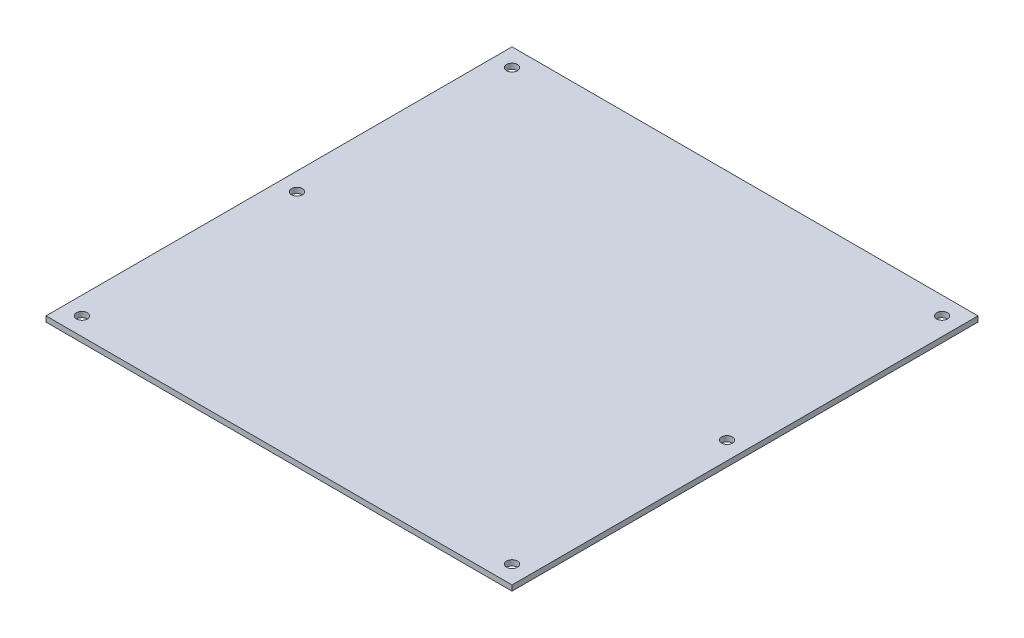
ISO-10303-21;
HEADER;
FILE_DESCRIPTION(('STEP AP214'),'2;1');
FILE_NAME('part.step','',(''),(''),'','','');
FILE_SCHEMA(('AUTOMOTIVE_DESIGN { 1 0 10303 214 1 1 1 1 }'));
ENDSEC;
DATA;
#1=APPLICATION_CONTEXT('core data for automotive mechanical design processes');
#2=APPLICATION_PROTOCOL_DEFINITION('international standard','automotive_design',2000,#1);
#3=PRODUCT_CONTEXT('',#1,'mechanical');
#4=PRODUCT('Part','Part','',(#3));
#5=PRODUCT_RELATED_PRODUCT_CATEGORY('part','',(#4));
#6=PRODUCT_DEFINITION_FORMATION('','',#4);
#7=PRODUCT_DEFINITION_CONTEXT('part definition',#1,'design');
#8=PRODUCT_DEFINITION('design','',#6,#7);
#9=PRODUCT_DEFINITION_SHAPE('','',#8);
#10=(LENGTH_UNIT() NAMED_UNIT(*) SI_UNIT(.MILLI.,.METRE.));
#11=(NAMED_UNIT(*) PLANE_ANGLE_UNIT() SI_UNIT($,.RADIAN.));
#12=(NAMED_UNIT(*) SI_UNIT($,.STERADIAN.) SOLID_ANGLE_UNIT());
#13=UNCERTAINTY_MEASURE_WITH_UNIT(LENGTH_MEASURE(1.E-05),#10,'distance_accuracy_value','');
#14=(GEOMETRIC_REPRESENTATION_CONTEXT(3) GLOBAL_UNCERTAINTY_ASSIGNED_CONTEXT((#13)) GLOBAL_UNIT_ASSIGNED_CONTEXT((#10,
#11,#12)) REPRESENTATION_CONTEXT('',''));
#15=CARTESIAN_POINT('',(0.,0.,0.));
#16=DIRECTION('',(0.,0.,1.));
#17=DIRECTION('',(1.,0.,0.));
#18=AXIS2_PLACEMENT_3D('',#15,#16,#17);
#19=CARTESIAN_POINT('',(-171.45,4.,171.45));
#20=DIRECTION('',(1.,0.,0.));
#21=DIRECTION('',(0.,0.,-1.));
#22=AXIS2_PLACEMENT_3D('',#19,#20,#21);
#23=PLANE('',#22);
#24=DIRECTION('',(0.,0.,1.));
#25=VECTOR('',#24,1.);
#26=CARTESIAN_POINT('',(-171.45,0.,171.45));
#27=LINE('',#26,#25);
#28=CARTESIAN_POINT('',(-171.45,0.,-171.45));
#29=VERTEX_POINT('',#28);
#30=CARTESIAN_POINT('',(-171.45,0.,171.45));
#31=VERTEX_POINT('',#30);
#32=EDGE_CURVE('E97',#29,#31,#27,.T.);
#33=ORIENTED_EDGE('',*,*,#32,.T.);
#34=DIRECTION('',(0.,-1.,0.));
#35=VECTOR('',#34,1.);
#36=CARTESIAN_POINT('',(-171.45,4.,171.45));
#37=LINE('',#36,#35);
#38=CARTESIAN_POINT('',(-171.45,4.,171.45));
#39=VERTEX_POINT('',#38);
#40=EDGE_CURVE('E11',#39,#31,#37,.T.);
#41=ORIENTED_EDGE('',*,*,#40,.F.);
#42=DIRECTION('',(0.,0.,1.));
#43=VECTOR('',#42,1.);
#44=CARTESIAN_POINT('',(-171.45,4.,171.45));
#45=LINE('',#44,#43);
#46=CARTESIAN_POINT('',(-171.45,4.,-171.45));
#47=VERTEX_POINT('',#46);
#48=EDGE_CURVE('E85',#47,#39,#45,.T.);
#49=ORIENTED_EDGE('',*,*,#48,.F.);
#50=DIRECTION('',(0.,-1.,0.));
#51=VECTOR('',#50,1.);
#52=CARTESIAN_POINT('',(-171.45,4.,-171.45));
#53=LINE('',#52,#51);
#54=EDGE_CURVE('E93',#47,#29,#53,.T.);
#55=ORIENTED_EDGE('',*,*,#54,.T.);
#56=EDGE_LOOP('',(#33,#41,#49,#55));
#57=FACE_BOUND('',#56,.T.);
#58=ADVANCED_FACE('F34',(#57),#23,.F.);
#59=CARTESIAN_POINT('',(171.45,4.,171.45));
#60=DIRECTION('',(0.,0.,-1.));
#61=DIRECTION('',(-1.,0.,0.));
#62=AXIS2_PLACEMENT_3D('',#59,#60,#61);
#63=PLANE('',#62);
#64=DIRECTION('',(1.,0.,0.));
#65=VECTOR('',#64,1.);
#66=CARTESIAN_POINT('',(171.45,0.,171.45));
#67=LINE('',#66,#65);
#68=CARTESIAN_POINT('',(171.45,0.,171.45));
#69=VERTEX_POINT('',#68);
#70=EDGE_CURVE('E89',#31,#69,#67,.T.);
#71=ORIENTED_EDGE('',*,*,#70,.T.);
#72=DIRECTION('',(0.,-1.,0.));
#73=VECTOR('',#72,1.);
#74=CARTESIAN_POINT('',(171.45,4.,171.45));
#75=LINE('',#74,#73);
#76=CARTESIAN_POINT('',(171.45,4.,171.45));
#77=VERTEX_POINT('',#76);
#78=EDGE_CURVE('E42',#77,#69,#75,.T.);
#79=ORIENTED_EDGE('',*,*,#78,.F.);
#80=DIRECTION('',(1.,0.,0.));
#81=VECTOR('',#80,1.);
#82=CARTESIAN_POINT('',(171.45,4.,171.45));
#83=LINE('',#82,#81);
#84=EDGE_CURVE('E80',#39,#77,#83,.T.);
#85=ORIENTED_EDGE('',*,*,#84,.F.);
#86=ORIENTED_EDGE('',*,*,#40,.T.);
#87=EDGE_LOOP('',(#71,#79,#85,#86));
#88=FACE_BOUND('',#87,.T.);
#89=ADVANCED_FACE('F88',(#88),#63,.F.);
#90=CARTESIAN_POINT('',(171.45,4.,171.45));
#91=DIRECTION('',(-1.,0.,0.));
#92=DIRECTION('',(0.,0.,1.));
#93=AXIS2_PLACEMENT_3D('',#90,#91,#92);
#94=PLANE('',#93);
#95=DIRECTION('',(0.,0.,-1.));
#96=VECTOR('',#95,1.);
#97=CARTESIAN_POINT('',(171.45,0.,171.45));
#98=LINE('',#97,#96);
#99=CARTESIAN_POINT('',(171.45,0.,-171.45));
#100=VERTEX_POINT('',#99);
#101=EDGE_CURVE('E67',#69,#100,#98,.T.);
#102=ORIENTED_EDGE('',*,*,#101,.T.);
#103=DIRECTION('',(0.,-1.,0.));
#104=VECTOR('',#103,1.);
#105=CARTESIAN_POINT('',(171.45,4.,-171.45));
#106=LINE('',#105,#104);
#107=CARTESIAN_POINT('',(171.45,4.,-171.45));
#108=VERTEX_POINT('',#107);
#109=EDGE_CURVE('E90',#108,#100,#106,.T.);
#110=ORIENTED_EDGE('',*,*,#109,.F.);
#111=DIRECTION('',(0.,0.,-1.));
#112=VECTOR('',#111,1.);
#113=CARTESIAN_POINT('',(171.45,4.,171.45));
#114=LINE('',#113,#112);
#115=EDGE_CURVE('E83',#77,#108,#114,.T.);
#116=ORIENTED_EDGE('',*,*,#115,.F.);
#117=ORIENTED_EDGE('',*,*,#78,.T.);
#118=EDGE_LOOP('',(#102,#110,#116,#117));
#119=FACE_BOUND('',#118,.T.);
#120=ADVANCED_FACE('F91',(#119),#94,.F.);
#121=CARTESIAN_POINT('',(171.45,4.,-171.45));
#122=DIRECTION('',(0.,0.,1.));
#123=DIRECTION('',(1.,0.,0.));
#124=AXIS2_PLACEMENT_3D('',#121,#122,#123);
#125=PLANE('',#124);
#126=DIRECTION('',(-1.,0.,0.));
#127=VECTOR('',#126,1.);
#128=CARTESIAN_POINT('',(171.45,0.,-171.45));
#129=LINE('',#128,#127);
#130=EDGE_CURVE('E73',#100,#29,#129,.T.);
#131=ORIENTED_EDGE('',*,*,#130,.T.);
#132=ORIENTED_EDGE('',*,*,#54,.F.);
#133=DIRECTION('',(-1.,0.,0.));
#134=VECTOR('',#133,1.);
#135=CARTESIAN_POINT('',(171.45,4.,-171.45));
#136=LINE('',#135,#134);
#137=EDGE_CURVE('E50',#108,#47,#136,.T.);
#138=ORIENTED_EDGE('',*,*,#137,.F.);
#139=ORIENTED_EDGE('',*,*,#109,.T.);
#140=EDGE_LOOP('',(#131,#132,#138,#139));
#141=FACE_BOUND('',#140,.T.);
#142=ADVANCED_FACE('F105',(#141),#125,.F.);
#143=CARTESIAN_POINT('',(0.,4.,0.));
#144=DIRECTION('',(0.,1.,0.));
#145=DIRECTION('',(0.,0.,1.));
#146=AXIS2_PLACEMENT_3D('',#143,#144,#145);
#147=PLANE('',#146);
#148=CARTESIAN_POINT('',(-158.225,4.,0.));
#149=DIRECTION('',(0.,1.,0.));
#150=DIRECTION('',(0.,0.,1.));
#151=AXIS2_PLACEMENT_3D('',#148,#149,#150);
#152=CIRCLE('',#151,3.99999999999999);
#153=CARTESIAN_POINT('',(-158.225,4.,3.99999999999999));
#154=VERTEX_POINT('',#153);
#155=EDGE_CURVE('E141',#154,#154,#152,.T.);
#156=ORIENTED_EDGE('',*,*,#155,.F.);
#157=EDGE_LOOP('',(#156));
#158=FACE_BOUND('',#157,.T.);
#159=CARTESIAN_POINT('',(-158.225,4.,158.225));
#160=DIRECTION('',(0.,1.,0.));
#161=DIRECTION('',(0.,0.,1.));
#162=AXIS2_PLACEMENT_3D('',#159,#160,#161);
#163=CIRCLE('',#162,3.99999999999999);
#164=CARTESIAN_POINT('',(-158.225,4.,162.225));
#165=VERTEX_POINT('',#164);
#166=EDGE_CURVE('E135',#165,#165,#163,.T.);
#167=ORIENTED_EDGE('',*,*,#166,.F.);
#168=EDGE_LOOP('',(#167));
#169=FACE_BOUND('',#168,.T.);
#170=CARTESIAN_POINT('',(158.225,4.,-158.225));
#171=DIRECTION('',(0.,1.,0.));
#172=DIRECTION('',(0.,0.,1.));
#173=AXIS2_PLACEMENT_3D('',#170,#171,#172);
#174=CIRCLE('',#173,3.99999999999999);
#175=CARTESIAN_POINT('',(158.225,4.,-154.225));
#176=VERTEX_POINT('',#175);
#177=EDGE_CURVE('E129',#176,#176,#174,.T.);
#178=ORIENTED_EDGE('',*,*,#177,.F.);
#179=EDGE_LOOP('',(#178));
#180=FACE_BOUND('',#179,.T.);
#181=CARTESIAN_POINT('',(158.225,4.,0.));
#182=DIRECTION('',(0.,1.,0.));
#183=DIRECTION('',(0.,0.,1.));
#184=AXIS2_PLACEMENT_3D('',#181,#182,#183);
#185=CIRCLE('',#184,3.99999999999999);
#186=CARTESIAN_POINT('',(158.225,4.,3.99999999999999));
#187=VERTEX_POINT('',#186);
#188=EDGE_CURVE('E123',#187,#187,#185,.T.);
#189=ORIENTED_EDGE('',*,*,#188,.F.);
#190=EDGE_LOOP('',(#189));
#191=FACE_BOUND('',#190,.T.);
#192=CARTESIAN_POINT('',(158.225,4.,158.225));
#193=DIRECTION('',(0.,1.,0.));
#194=DIRECTION('',(0.,0.,1.));
#195=AXIS2_PLACEMENT_3D('',#192,#193,#194);
#196=CIRCLE('',#195,3.99999999999999);
#197=CARTESIAN_POINT('',(158.225,4.,162.225));
#198=VERTEX_POINT('',#197);
#199=EDGE_CURVE('E117',#198,#198,#196,.T.);
#200=ORIENTED_EDGE('',*,*,#199,.F.);
#201=EDGE_LOOP('',(#200));
#202=FACE_BOUND('',#201,.T.);
#203=CARTESIAN_POINT('',(-158.225,4.,-158.225));
#204=DIRECTION('',(0.,1.,0.));
#205=DIRECTION('',(0.,0.,1.));
#206=AXIS2_PLACEMENT_3D('',#203,#204,#205);
#207=CIRCLE('',#206,3.99999999999999);
#208=CARTESIAN_POINT('',(-158.225,4.,-154.225));
#209=VERTEX_POINT('',#208);
#210=EDGE_CURVE('E111',#209,#209,#207,.T.);
#211=ORIENTED_EDGE('',*,*,#210,.F.);
#212=EDGE_LOOP('',(#211));
#213=FACE_BOUND('',#212,.T.);
#214=ORIENTED_EDGE('',*,*,#48,.T.);
#215=ORIENTED_EDGE('',*,*,#84,.T.);
#216=ORIENTED_EDGE('',*,*,#115,.T.);
#217=ORIENTED_EDGE('',*,*,#137,.T.);
#218=EDGE_LOOP('',(#214,#215,#216,#217));
#219=FACE_BOUND('',#218,.T.);
#220=ADVANCED_FACE('F81',(#158,#169,#180,#191,#202,#213,#219),#147,.T.);
#221=CARTESIAN_POINT('',(0.,0.,0.));
#222=DIRECTION('',(0.,1.,0.));
#223=DIRECTION('',(0.,0.,1.));
#224=AXIS2_PLACEMENT_3D('',#221,#222,#223);
#225=PLANE('',#224);
#226=CARTESIAN_POINT('',(-158.225,0.,0.));
#227=DIRECTION('',(0.,1.,0.));
#228=DIRECTION('',(0.,0.,1.));
#229=AXIS2_PLACEMENT_3D('',#226,#227,#228);
#230=CIRCLE('',#229,3.99999999999999);
#231=CARTESIAN_POINT('',(-158.225,0.,3.99999999999999));
#232=VERTEX_POINT('',#231);
#233=EDGE_CURVE('E114',#232,#232,#230,.T.);
#234=ORIENTED_EDGE('',*,*,#233,.T.);
#235=EDGE_LOOP('',(#234));
#236=FACE_BOUND('',#235,.T.);
#237=CARTESIAN_POINT('',(-158.225,0.,158.225));
#238=DIRECTION('',(0.,1.,0.));
#239=DIRECTION('',(0.,0.,1.));
#240=AXIS2_PLACEMENT_3D('',#237,#238,#239);
#241=CIRCLE('',#240,3.99999999999999);
#242=CARTESIAN_POINT('',(-158.225,0.,162.225));
#243=VERTEX_POINT('',#242);
#244=EDGE_CURVE('E138',#243,#243,#241,.T.);
#245=ORIENTED_EDGE('',*,*,#244,.T.);
#246=EDGE_LOOP('',(#245));
#247=FACE_BOUND('',#246,.T.);
#248=CARTESIAN_POINT('',(158.225,0.,-158.225));
#249=DIRECTION('',(0.,1.,0.));
#250=DIRECTION('',(0.,0.,1.));
#251=AXIS2_PLACEMENT_3D('',#248,#249,#250);
#252=CIRCLE('',#251,3.99999999999999);
#253=CARTESIAN_POINT('',(158.225,0.,-154.225));
#254=VERTEX_POINT('',#253);
#255=EDGE_CURVE('E132',#254,#254,#252,.T.);
#256=ORIENTED_EDGE('',*,*,#255,.T.);
#257=EDGE_LOOP('',(#256));
#258=FACE_BOUND('',#257,.T.);
#259=CARTESIAN_POINT('',(158.225,0.,0.));
#260=DIRECTION('',(0.,1.,0.));
#261=DIRECTION('',(0.,0.,1.));
#262=AXIS2_PLACEMENT_3D('',#259,#260,#261);
#263=CIRCLE('',#262,3.99999999999999);
#264=CARTESIAN_POINT('',(158.225,0.,3.99999999999999));
#265=VERTEX_POINT('',#264);
#266=EDGE_CURVE('E126',#265,#265,#263,.T.);
#267=ORIENTED_EDGE('',*,*,#266,.T.);
#268=EDGE_LOOP('',(#267));
#269=FACE_BOUND('',#268,.T.);
#270=CARTESIAN_POINT('',(158.225,0.,158.225));
#271=DIRECTION('',(0.,1.,0.));
#272=DIRECTION('',(0.,0.,1.));
#273=AXIS2_PLACEMENT_3D('',#270,#271,#272);
#274=CIRCLE('',#273,3.99999999999999);
#275=CARTESIAN_POINT('',(158.225,0.,162.225));
#276=VERTEX_POINT('',#275);
#277=EDGE_CURVE('E120',#276,#276,#274,.T.);
#278=ORIENTED_EDGE('',*,*,#277,.T.);
#279=EDGE_LOOP('',(#278));
#280=FACE_BOUND('',#279,.T.);
#281=CARTESIAN_POINT('',(-158.225,0.,-158.225));
#282=DIRECTION('',(0.,1.,0.));
#283=DIRECTION('',(0.,0.,1.));
#284=AXIS2_PLACEMENT_3D('',#281,#282,#283);
#285=CIRCLE('',#284,3.99999999999999);
#286=CARTESIAN_POINT('',(-158.225,0.,-154.225));
#287=VERTEX_POINT('',#286);
#288=EDGE_CURVE('E100',#287,#287,#285,.T.);
#289=ORIENTED_EDGE('',*,*,#288,.T.);
#290=EDGE_LOOP('',(#289));
#291=FACE_BOUND('',#290,.T.);
#292=ORIENTED_EDGE('',*,*,#32,.F.);
#293=ORIENTED_EDGE('',*,*,#130,.F.);
#294=ORIENTED_EDGE('',*,*,#101,.F.);
#295=ORIENTED_EDGE('',*,*,#70,.F.);
#296=EDGE_LOOP('',(#292,#293,#294,#295));
#297=FACE_BOUND('',#296,.T.);
#298=ADVANCED_FACE('F108',(#236,#247,#258,#269,#280,#291,#297),#225,.F.);
#299=CARTESIAN_POINT('',(-158.225,0.,-158.225));
#300=DIRECTION('',(0.,1.,0.));
#301=DIRECTION('',(0.,0.,1.));
#302=AXIS2_PLACEMENT_3D('',#299,#300,#301);
#303=CYLINDRICAL_SURFACE('',#302,3.99999999999999);
#304=ORIENTED_EDGE('',*,*,#288,.F.);
#305=EDGE_LOOP('',(#304));
#306=FACE_BOUND('',#305,.T.);
#307=ORIENTED_EDGE('',*,*,#210,.T.);
#308=EDGE_LOOP('',(#307));
#309=FACE_BOUND('',#308,.T.);
#310=ADVANCED_FACE('F169',(#306,#309),#303,.F.);
#311=CARTESIAN_POINT('',(158.225,0.,158.225));
#312=DIRECTION('',(0.,1.,0.));
#313=DIRECTION('',(0.,0.,1.));
#314=AXIS2_PLACEMENT_3D('',#311,#312,#313);
#315=CYLINDRICAL_SURFACE('',#314,3.99999999999999);
#316=ORIENTED_EDGE('',*,*,#277,.F.);
#317=EDGE_LOOP('',(#316));
#318=FACE_BOUND('',#317,.T.);
#319=ORIENTED_EDGE('',*,*,#199,.T.);
#320=EDGE_LOOP('',(#319));
#321=FACE_BOUND('',#320,.T.);
#322=ADVANCED_FACE('F171',(#318,#321),#315,.F.);
#323=CARTESIAN_POINT('',(158.225,0.,0.));
#324=DIRECTION('',(0.,1.,0.));
#325=DIRECTION('',(0.,0.,1.));
#326=AXIS2_PLACEMENT_3D('',#323,#324,#325);
#327=CYLINDRICAL_SURFACE('',#326,3.99999999999999);
#328=ORIENTED_EDGE('',*,*,#266,.F.);
#329=EDGE_LOOP('',(#328));
#330=FACE_BOUND('',#329,.T.);
#331=ORIENTED_EDGE('',*,*,#188,.T.);
#332=EDGE_LOOP('',(#331));
#333=FACE_BOUND('',#332,.T.);
#334=ADVANCED_FACE('F178',(#330,#333),#327,.F.);
#335=CARTESIAN_POINT('',(158.225,0.,-158.225));
#336=DIRECTION('',(0.,1.,0.));
#337=DIRECTION('',(0.,0.,1.));
#338=AXIS2_PLACEMENT_3D('',#335,#336,#337);
#339=CYLINDRICAL_SURFACE('',#338,3.99999999999999);
#340=ORIENTED_EDGE('',*,*,#255,.F.);
#341=EDGE_LOOP('',(#340));
#342=FACE_BOUND('',#341,.T.);
#343=ORIENTED_EDGE('',*,*,#177,.T.);
#344=EDGE_LOOP('',(#343));
#345=FACE_BOUND('',#344,.T.);
#346=ADVANCED_FACE('F224',(#342,#345),#339,.F.);
#347=CARTESIAN_POINT('',(-158.225,0.,158.225));
#348=DIRECTION('',(0.,1.,0.));
#349=DIRECTION('',(0.,0.,1.));
#350=AXIS2_PLACEMENT_3D('',#347,#348,#349);
#351=CYLINDRICAL_SURFACE('',#350,3.99999999999999);
#352=ORIENTED_EDGE('',*,*,#244,.F.);
#353=EDGE_LOOP('',(#352));
#354=FACE_BOUND('',#353,.T.);
#355=ORIENTED_EDGE('',*,*,#166,.T.);
#356=EDGE_LOOP('',(#355));
#357=FACE_BOUND('',#356,.T.);
#358=ADVANCED_FACE('F152',(#354,#357),#351,.F.);
#359=CARTESIAN_POINT('',(-158.225,0.,0.));
#360=DIRECTION('',(0.,1.,0.));
#361=DIRECTION('',(0.,0.,1.));
#362=AXIS2_PLACEMENT_3D('',#359,#360,#361);
#363=CYLINDRICAL_SURFACE('',#362,3.99999999999999);
#364=ORIENTED_EDGE('',*,*,#233,.F.);
#365=EDGE_LOOP('',(#364));
#366=FACE_BOUND('',#365,.T.);
#367=ORIENTED_EDGE('',*,*,#155,.T.);
#368=EDGE_LOOP('',(#367));
#369=FACE_BOUND('',#368,.T.);
#370=ADVANCED_FACE('F149',(#366,#369),#363,.F.);
#371=CLOSED_SHELL('',(#58,#89,#120,#142,#220,#298,#310,#322,#334,#346,#358,#370));
#372=MANIFOLD_SOLID_BREP('B2',#371);
#373=ADVANCED_BREP_SHAPE_REPRESENTATION('',(#18,#372),#14);
#374=SHAPE_DEFINITION_REPRESENTATION(#9,#373);
ENDSEC;
END-ISO-10303-21;
